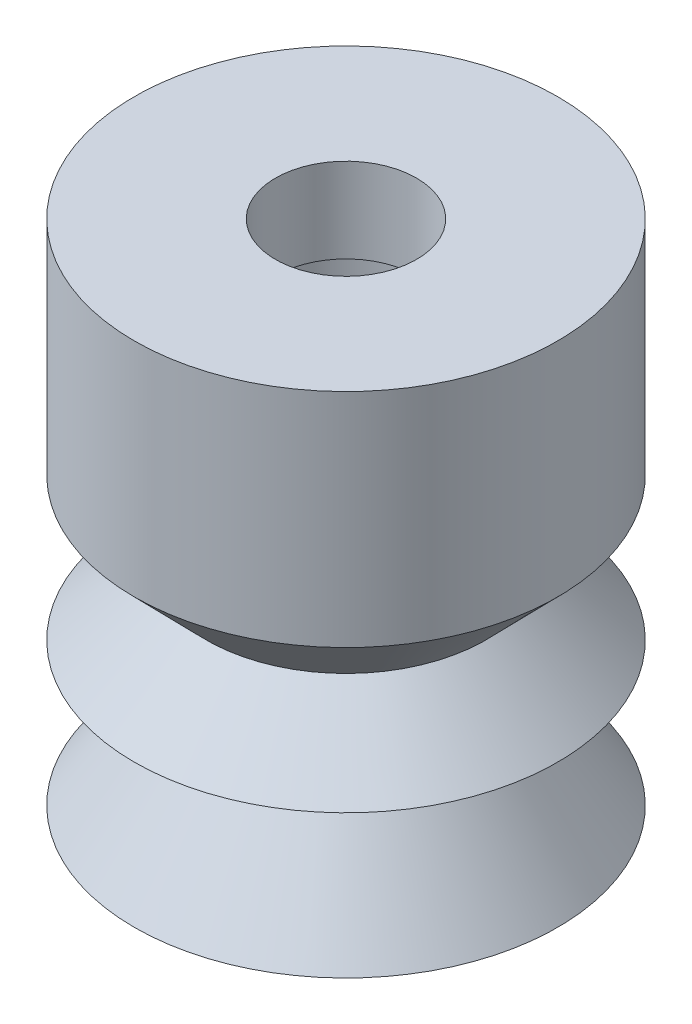
ISO-10303-21;
HEADER;
FILE_DESCRIPTION(('STEP AP214'),'2;1');
FILE_NAME('part.step','',(''),(''),'','','');
FILE_SCHEMA(('AUTOMOTIVE_DESIGN { 1 0 10303 214 1 1 1 1 }'));
ENDSEC;
DATA;
#1=APPLICATION_CONTEXT('core data for automotive mechanical design processes');
#2=APPLICATION_PROTOCOL_DEFINITION('international standard','automotive_design',2000,#1);
#3=PRODUCT_CONTEXT('',#1,'mechanical');
#4=PRODUCT('Part','Part','',(#3));
#5=PRODUCT_RELATED_PRODUCT_CATEGORY('part','',(#4));
#6=PRODUCT_DEFINITION_FORMATION('','',#4);
#7=PRODUCT_DEFINITION_CONTEXT('part definition',#1,'design');
#8=PRODUCT_DEFINITION('design','',#6,#7);
#9=PRODUCT_DEFINITION_SHAPE('','',#8);
#10=(LENGTH_UNIT() NAMED_UNIT(*) SI_UNIT(.MILLI.,.METRE.));
#11=(NAMED_UNIT(*) PLANE_ANGLE_UNIT() SI_UNIT($,.RADIAN.));
#12=(NAMED_UNIT(*) SI_UNIT($,.STERADIAN.) SOLID_ANGLE_UNIT());
#13=UNCERTAINTY_MEASURE_WITH_UNIT(LENGTH_MEASURE(1.E-05),#10,'distance_accuracy_value','');
#14=(GEOMETRIC_REPRESENTATION_CONTEXT(3) GLOBAL_UNCERTAINTY_ASSIGNED_CONTEXT((#13)) GLOBAL_UNIT_ASSIGNED_CONTEXT((#10,
#11,#12)) REPRESENTATION_CONTEXT('',''));
#15=CARTESIAN_POINT('',(0.,0.,0.));
#16=DIRECTION('',(0.,0.,1.));
#17=DIRECTION('',(1.,0.,0.));
#18=AXIS2_PLACEMENT_3D('',#15,#16,#17);
#19=CARTESIAN_POINT('',(0.,0.,0.));
#20=DIRECTION('',(0.,-1.,0.));
#21=DIRECTION('',(0.,0.,-1.));
#22=AXIS2_PLACEMENT_3D('',#19,#20,#21);
#23=CYLINDRICAL_SURFACE('',#22,2.5);
#24=CARTESIAN_POINT('',(0.,18.,0.));
#25=DIRECTION('',(0.,-1.,0.));
#26=DIRECTION('',(0.,0.,-1.));
#27=AXIS2_PLACEMENT_3D('',#24,#25,#26);
#28=CIRCLE('',#27,2.5);
#29=CARTESIAN_POINT('',(0.,18.,-2.5));
#30=VERTEX_POINT('',#29);
#31=EDGE_CURVE('E10',#30,#30,#28,.T.);
#32=ORIENTED_EDGE('',*,*,#31,.F.);
#33=EDGE_LOOP('',(#32));
#34=FACE_BOUND('',#33,.T.);
#35=CARTESIAN_POINT('',(0.,15.,0.));
#36=DIRECTION('',(0.,-1.,0.));
#37=DIRECTION('',(0.,0.,-1.));
#38=AXIS2_PLACEMENT_3D('',#35,#36,#37);
#39=CIRCLE('',#38,2.5);
#40=CARTESIAN_POINT('',(0.,15.,-2.5));
#41=VERTEX_POINT('',#40);
#42=EDGE_CURVE('E81',#41,#41,#39,.T.);
#43=ORIENTED_EDGE('',*,*,#42,.T.);
#44=EDGE_LOOP('',(#43));
#45=FACE_BOUND('',#44,.T.);
#46=ADVANCED_FACE('F32',(#34,#45),#23,.F.);
#47=CARTESIAN_POINT('',(-2.5,18.,0.));
#48=DIRECTION('',(0.,-1.,0.));
#49=DIRECTION('',(0.,0.,-1.));
#50=AXIS2_PLACEMENT_3D('',#47,#48,#49);
#51=PLANE('',#50);
#52=CARTESIAN_POINT('',(0.,18.,0.));
#53=DIRECTION('',(0.,-1.,0.));
#54=DIRECTION('',(0.,0.,-1.));
#55=AXIS2_PLACEMENT_3D('',#52,#53,#54);
#56=CIRCLE('',#55,7.5);
#57=CARTESIAN_POINT('',(0.,18.,-7.5));
#58=VERTEX_POINT('',#57);
#59=EDGE_CURVE('E38',#58,#58,#56,.T.);
#60=ORIENTED_EDGE('',*,*,#59,.F.);
#61=EDGE_LOOP('',(#60));
#62=FACE_BOUND('',#61,.T.);
#63=ORIENTED_EDGE('',*,*,#31,.T.);
#64=EDGE_LOOP('',(#63));
#65=FACE_BOUND('',#64,.T.);
#66=ADVANCED_FACE('F160',(#62,#65),#51,.F.);
#67=CARTESIAN_POINT('',(0.,0.,0.));
#68=DIRECTION('',(0.,-1.,0.));
#69=DIRECTION('',(0.,0.,-1.));
#70=AXIS2_PLACEMENT_3D('',#67,#68,#69);
#71=CYLINDRICAL_SURFACE('',#70,7.5);
#72=CARTESIAN_POINT('',(0.,10.1414920357619,0.));
#73=DIRECTION('',(0.,-1.,0.));
#74=DIRECTION('',(0.,0.,-1.));
#75=AXIS2_PLACEMENT_3D('',#72,#73,#74);
#76=CIRCLE('',#75,7.5);
#77=CARTESIAN_POINT('',(0.,10.1414920357619,-7.5));
#78=VERTEX_POINT('',#77);
#79=EDGE_CURVE('E42',#78,#78,#76,.T.);
#80=ORIENTED_EDGE('',*,*,#79,.F.);
#81=EDGE_LOOP('',(#80));
#82=FACE_BOUND('',#81,.T.);
#83=ORIENTED_EDGE('',*,*,#59,.T.);
#84=EDGE_LOOP('',(#83));
#85=FACE_BOUND('',#84,.T.);
#86=ADVANCED_FACE('F155',(#82,#85),#71,.T.);
#87=CARTESIAN_POINT('',(0.,10.1414920357619,0.));
#88=DIRECTION('',(0.,1.,0.));
#89=DIRECTION('',(0.,0.,1.));
#90=AXIS2_PLACEMENT_3D('',#87,#88,#89);
#91=CONICAL_SURFACE('',#90,7.5,0.775945219730871);
#92=CARTESIAN_POINT('',(0.,7.54422525791049,0.));
#93=DIRECTION('',(0.,-1.,0.));
#94=DIRECTION('',(0.,0.,-1.));
#95=AXIS2_PLACEMENT_3D('',#92,#93,#94);
#96=CIRCLE('',#95,4.95137846345722);
#97=CARTESIAN_POINT('',(0.,7.54422525791049,-4.95137846345722));
#98=VERTEX_POINT('',#97);
#99=EDGE_CURVE('E46',#98,#98,#96,.T.);
#100=ORIENTED_EDGE('',*,*,#99,.F.);
#101=EDGE_LOOP('',(#100));
#102=FACE_BOUND('',#101,.T.);
#103=ORIENTED_EDGE('',*,*,#79,.T.);
#104=EDGE_LOOP('',(#103));
#105=FACE_BOUND('',#104,.T.);
#106=ADVANCED_FACE('F149',(#102,#105),#91,.T.);
#107=CARTESIAN_POINT('',(0.,7.54422525791049,0.));
#108=DIRECTION('',(0.,-1.,0.));
#109=DIRECTION('',(0.,0.,-1.));
#110=AXIS2_PLACEMENT_3D('',#107,#108,#109);
#111=CONICAL_SURFACE('',#110,4.95137846345722,0.800359370512206);
#112=CARTESIAN_POINT('',(0.,5.07074601788093,0.));
#113=DIRECTION('',(0.,-1.,0.));
#114=DIRECTION('',(0.,0.,-1.));
#115=AXIS2_PLACEMENT_3D('',#112,#113,#114);
#116=CIRCLE('',#115,7.5);
#117=CARTESIAN_POINT('',(0.,5.07074601788093,-7.5));
#118=VERTEX_POINT('',#117);
#119=EDGE_CURVE('E51',#118,#118,#116,.T.);
#120=ORIENTED_EDGE('',*,*,#119,.F.);
#121=EDGE_LOOP('',(#120));
#122=FACE_BOUND('',#121,.T.);
#123=ORIENTED_EDGE('',*,*,#99,.T.);
#124=EDGE_LOOP('',(#123));
#125=FACE_BOUND('',#124,.T.);
#126=ADVANCED_FACE('F143',(#122,#125),#111,.T.);
#127=CARTESIAN_POINT('',(0.,5.07074601788093,0.));
#128=DIRECTION('',(0.,1.,0.));
#129=DIRECTION('',(0.,0.,1.));
#130=AXIS2_PLACEMENT_3D('',#127,#128,#129);
#131=CONICAL_SURFACE('',#130,7.5,1.0494749072409);
#132=CARTESIAN_POINT('',(0.,3.60702736402596,0.));
#133=DIRECTION('',(0.,-1.,0.));
#134=DIRECTION('',(0.,0.,-1.));
#135=AXIS2_PLACEMENT_3D('',#132,#133,#134);
#136=CIRCLE('',#135,4.95137846345722);
#137=CARTESIAN_POINT('',(0.,3.60702736402596,-4.95137846345722));
#138=VERTEX_POINT('',#137);
#139=EDGE_CURVE('E54',#138,#138,#136,.T.);
#140=ORIENTED_EDGE('',*,*,#139,.F.);
#141=EDGE_LOOP('',(#140));
#142=FACE_BOUND('',#141,.T.);
#143=ORIENTED_EDGE('',*,*,#119,.T.);
#144=EDGE_LOOP('',(#143));
#145=FACE_BOUND('',#144,.T.);
#146=ADVANCED_FACE('F137',(#142,#145),#131,.T.);
#147=CARTESIAN_POINT('',(0.,3.60702736402596,0.));
#148=DIRECTION('',(0.,-1.,0.));
#149=DIRECTION('',(0.,0.,-1.));
#150=AXIS2_PLACEMENT_3D('',#147,#148,#149);
#151=CONICAL_SURFACE('',#150,4.95137846345722,0.615122542850016);
#152=CARTESIAN_POINT('',(0.,0.,0.));
#153=DIRECTION('',(0.,-1.,0.));
#154=DIRECTION('',(0.,0.,-1.));
#155=AXIS2_PLACEMENT_3D('',#152,#153,#154);
#156=CIRCLE('',#155,7.5);
#157=CARTESIAN_POINT('',(0.,0.,-7.5));
#158=VERTEX_POINT('',#157);
#159=EDGE_CURVE('E57',#158,#158,#156,.T.);
#160=ORIENTED_EDGE('',*,*,#159,.F.);
#161=EDGE_LOOP('',(#160));
#162=FACE_BOUND('',#161,.T.);
#163=ORIENTED_EDGE('',*,*,#139,.T.);
#164=EDGE_LOOP('',(#163));
#165=FACE_BOUND('',#164,.T.);
#166=ADVANCED_FACE('F131',(#162,#165),#151,.T.);
#167=CARTESIAN_POINT('',(-7.5,0.,0.));
#168=DIRECTION('',(0.,1.,0.));
#169=DIRECTION('',(0.,0.,1.));
#170=AXIS2_PLACEMENT_3D('',#167,#168,#169);
#171=PLANE('',#170);
#172=CARTESIAN_POINT('',(0.,0.,0.));
#173=DIRECTION('',(0.,-1.,0.));
#174=DIRECTION('',(0.,0.,-1.));
#175=AXIS2_PLACEMENT_3D('',#172,#173,#174);
#176=CIRCLE('',#175,7.33699276403686);
#177=CARTESIAN_POINT('',(0.,0.,-7.33699276403686));
#178=VERTEX_POINT('',#177);
#179=EDGE_CURVE('E60',#178,#178,#176,.T.);
#180=ORIENTED_EDGE('',*,*,#179,.F.);
#181=EDGE_LOOP('',(#180));
#182=FACE_BOUND('',#181,.T.);
#183=ORIENTED_EDGE('',*,*,#159,.T.);
#184=EDGE_LOOP('',(#183));
#185=FACE_BOUND('',#184,.T.);
#186=ADVANCED_FACE('F125',(#182,#185),#171,.F.);
#187=CARTESIAN_POINT('',(0.,0.,0.));
#188=DIRECTION('',(0.,-1.,0.));
#189=DIRECTION('',(0.,0.,-1.));
#190=AXIS2_PLACEMENT_3D('',#187,#188,#189);
#191=CONICAL_SURFACE('',#190,7.33699276403686,0.816280976946262);
#192=CARTESIAN_POINT('',(0.,3.60702736402596,0.));
#193=DIRECTION('',(0.,-1.,0.));
#194=DIRECTION('',(0.,0.,-1.));
#195=AXIS2_PLACEMENT_3D('',#192,#193,#194);
#196=CIRCLE('',#195,3.5);
#197=CARTESIAN_POINT('',(0.,3.60702736402596,-3.5));
#198=VERTEX_POINT('',#197);
#199=EDGE_CURVE('E63',#198,#198,#196,.T.);
#200=ORIENTED_EDGE('',*,*,#199,.F.);
#201=EDGE_LOOP('',(#200));
#202=FACE_BOUND('',#201,.T.);
#203=ORIENTED_EDGE('',*,*,#179,.T.);
#204=EDGE_LOOP('',(#203));
#205=FACE_BOUND('',#204,.T.);
#206=ADVANCED_FACE('F119',(#202,#205),#191,.F.);
#207=CARTESIAN_POINT('',(0.,3.60702736402596,0.));
#208=DIRECTION('',(0.,1.,0.));
#209=DIRECTION('',(0.,0.,1.));
#210=AXIS2_PLACEMENT_3D('',#207,#208,#209);
#211=CONICAL_SURFACE('',#210,3.5,1.0494749072409);
#212=CARTESIAN_POINT('',(0.,5.07074601788093,0.));
#213=DIRECTION('',(0.,-1.,0.));
#214=DIRECTION('',(0.,0.,-1.));
#215=AXIS2_PLACEMENT_3D('',#212,#213,#214);
#216=CIRCLE('',#215,6.04862153654278);
#217=CARTESIAN_POINT('',(0.,5.07074601788093,-6.04862153654278));
#218=VERTEX_POINT('',#217);
#219=EDGE_CURVE('E66',#218,#218,#216,.T.);
#220=ORIENTED_EDGE('',*,*,#219,.F.);
#221=EDGE_LOOP('',(#220));
#222=FACE_BOUND('',#221,.T.);
#223=ORIENTED_EDGE('',*,*,#199,.T.);
#224=EDGE_LOOP('',(#223));
#225=FACE_BOUND('',#224,.T.);
#226=ADVANCED_FACE('F113',(#222,#225),#211,.F.);
#227=CARTESIAN_POINT('',(0.,5.07074601788093,0.));
#228=DIRECTION('',(0.,-1.,0.));
#229=DIRECTION('',(0.,0.,-1.));
#230=AXIS2_PLACEMENT_3D('',#227,#228,#229);
#231=CONICAL_SURFACE('',#230,6.04862153654278,0.800359370512207);
#232=CARTESIAN_POINT('',(0.,9.,0.));
#233=DIRECTION('',(0.,-1.,0.));
#234=DIRECTION('',(0.,0.,-1.));
#235=AXIS2_PLACEMENT_3D('',#232,#233,#234);
#236=CIRCLE('',#235,2.);
#237=CARTESIAN_POINT('',(0.,9.,-2.));
#238=VERTEX_POINT('',#237);
#239=EDGE_CURVE('E69',#238,#238,#236,.T.);
#240=CARTESIAN_POINT('',(0.,9.,-2.));
#241=CARTESIAN_POINT('',(0.,8.95907027101959,-2.04217314100565));
#242=CARTESIAN_POINT('',(0.,8.91814054203919,-2.08434628201131));
#243=CARTESIAN_POINT('',(0.,8.83628108407837,-2.16869256402261));
#244=CARTESIAN_POINT('',(0.,8.79535135509797,-2.21086570502827));
#245=CARTESIAN_POINT('',(0.,8.71349189713715,-2.29521198703958));
#246=CARTESIAN_POINT('',(0.,8.67256216815674,-2.33738512804523));
#247=CARTESIAN_POINT('',(0.,8.59070271019593,-2.42173141005654));
#248=CARTESIAN_POINT('',(0.,8.54977298121552,-2.46390455106219));
#249=CARTESIAN_POINT('',(0.,8.46791352325471,-2.5482508330735));
#250=CARTESIAN_POINT('',(0.,8.4269837942743,-2.59042397407915));
#251=CARTESIAN_POINT('',(0.,8.34512433631349,-2.67477025609046));
#252=CARTESIAN_POINT('',(0.,8.30419460733308,-2.71694339709612));
#253=CARTESIAN_POINT('',(0.,8.22233514937227,-2.80128967910742));
#254=CARTESIAN_POINT('',(0.,8.18140542039186,-2.84346282011308));
#255=CARTESIAN_POINT('',(0.,8.09954596243105,-2.92780910212439));
#256=CARTESIAN_POINT('',(0.,8.05861623345064,-2.96998224313004));
#257=CARTESIAN_POINT('',(0.,7.97675677548983,-3.05432852514135));
#258=CARTESIAN_POINT('',(0.,7.93582704650942,-3.096501666147));
#259=CARTESIAN_POINT('',(0.,7.8539675885486,-3.18084794815831));
#260=CARTESIAN_POINT('',(0.,7.8130378595682,-3.22302108916396));
#261=CARTESIAN_POINT('',(0.,7.73117840160738,-3.30736737117527));
#262=CARTESIAN_POINT('',(0.,7.69024867262698,-3.34954051218092));
#263=CARTESIAN_POINT('',(0.,7.60838921466616,-3.43388679419223));
#264=CARTESIAN_POINT('',(0.,7.56745948568576,-3.47605993519789));
#265=CARTESIAN_POINT('',(0.,7.48560002772494,-3.5604062172092));
#266=CARTESIAN_POINT('',(0.,7.44467029874453,-3.60257935821485));
#267=CARTESIAN_POINT('',(0.,7.36281084078372,-3.68692564022616));
#268=CARTESIAN_POINT('',(0.,7.32188111180331,-3.72909878123181));
#269=CARTESIAN_POINT('',(0.,7.2400216538425,-3.81344506324312));
#270=CARTESIAN_POINT('',(0.,7.19909192486209,-3.85561820424877));
#271=CARTESIAN_POINT('',(0.,7.11723246690128,-3.93996448626008));
#272=CARTESIAN_POINT('',(0.,7.07630273792087,-3.98213762726574));
#273=CARTESIAN_POINT('',(0.,6.99444327996006,-4.06648390927704));
#274=CARTESIAN_POINT('',(0.,6.95351355097965,-4.1086570502827));
#275=CARTESIAN_POINT('',(0.,6.87165409301884,-4.193003332294));
#276=CARTESIAN_POINT('',(0.,6.83072436403843,-4.23517647329966));
#277=CARTESIAN_POINT('',(0.,6.74886490607761,-4.31952275531097));
#278=CARTESIAN_POINT('',(0.,6.70793517709721,-4.36169589631662));
#279=CARTESIAN_POINT('',(0.,6.6260757191364,-4.44604217832793));
#280=CARTESIAN_POINT('',(0.,6.58514599015599,-4.48821531933358));
#281=CARTESIAN_POINT('',(0.,6.50328653219517,-4.57256160134489));
#282=CARTESIAN_POINT('',(0.,6.46235680321477,-4.61473474235054));
#283=CARTESIAN_POINT('',(0.,6.38049734525395,-4.69908102436185));
#284=CARTESIAN_POINT('',(0.,6.33956761627354,-4.74125416536751));
#285=CARTESIAN_POINT('',(0.,6.25770815831273,-4.82560044737881));
#286=CARTESIAN_POINT('',(0.,6.21677842933232,-4.86777358838447));
#287=CARTESIAN_POINT('',(0.,6.13491897137151,-4.95211987039578));
#288=CARTESIAN_POINT('',(0.,6.0939892423911,-4.99429301140143));
#289=CARTESIAN_POINT('',(0.,6.01212978443029,-5.07863929341274));
#290=CARTESIAN_POINT('',(0.,5.97120005544988,-5.12081243441839));
#291=CARTESIAN_POINT('',(0.,5.88934059748907,-5.2051587164297));
#292=CARTESIAN_POINT('',(0.,5.84841086850866,-5.24733185743535));
#293=CARTESIAN_POINT('',(0.,5.76655141054785,-5.33167813944666));
#294=CARTESIAN_POINT('',(0.,5.72562168156744,-5.37385128045232));
#295=CARTESIAN_POINT('',(0.,5.64376222360663,-5.45819756246362));
#296=CARTESIAN_POINT('',(0.,5.60283249462622,-5.50037070346928));
#297=CARTESIAN_POINT('',(0.,5.52097303666541,-5.58471698548059));
#298=CARTESIAN_POINT('',(0.,5.480043307685,-5.62689012648624));
#299=CARTESIAN_POINT('',(0.,5.39818384972418,-5.71123640849755));
#300=CARTESIAN_POINT('',(0.,5.35725412074378,-5.7534095495032));
#301=CARTESIAN_POINT('',(0.,5.27539466278296,-5.83775583151451));
#302=CARTESIAN_POINT('',(0.,5.23446493380256,-5.87992897252016));
#303=CARTESIAN_POINT('',(0.,5.15260547584174,-5.96427525453147));
#304=CARTESIAN_POINT('',(0.,5.11167574686134,-6.00644839553712));
#305=CARTESIAN_POINT('',(0.,5.07074601788093,-6.04862153654278));
#306=B_SPLINE_CURVE_WITH_KNOTS('',3,(#240,#241,#242,#243,#244,#245,#246,#247,#248,#249,#250,
#251,#252,#253,#254,#255,#256,#257,#258,#259,#260,#261,#262,#263,#264,#265,#266,#267,#268,#269,
#270,#271,#272,#273,#274,#275,#276,#277,#278,#279,#280,#281,#282,#283,#284,#285,#286,#287,#288,
#289,#290,#291,#292,#293,#294,#295,#296,#297,#298,#299,#300,#301,#302,#303,#304,#305),
.UNSPECIFIED.,.F.,.F.,(4,2,2,2,2,2,2,2,2,2,2,2,2,2,2,2,2,2,2,2,2,2,2,2,2,2,2,2,2,2,2,2,4),(0.,
0.176307540480352,0.352615080960705,0.528922621441057,0.705230161921409,0.881537702401762,
1.05784524288211,1.23415278336247,1.41046032384282,1.58676786432317,1.76307540480352,
1.93938294528388,2.11569048576423,2.29199802624458,2.46830556672493,2.64461310720529,
2.82092064768564,2.99722818816599,3.17353572864634,3.34984326912669,3.52615080960705,
3.7024583500874,3.87876589056775,4.0550734310481,4.23138097152846,4.40768851200881,
4.58399605248916,4.76030359296951,4.93661113344987,5.11291867393022,5.28922621441057,
5.46553375489092,5.64184129537128),.UNSPECIFIED.);
#307=EDGE_CURVE('BSEAM107',#238,#218,#306,.T.);
#308=ORIENTED_EDGE('',*,*,#239,.F.);
#309=ORIENTED_EDGE('',*,*,#219,.T.);
#310=ORIENTED_EDGE('',*,*,#307,.T.);
#311=ORIENTED_EDGE('',*,*,#307,.F.);
#312=EDGE_LOOP('',(#308,#310,#309,#311));
#313=FACE_BOUND('',#312,.T.);
#314=ADVANCED_FACE('F107',(#313),#231,.F.);
#315=CARTESIAN_POINT('',(0.,0.,0.));
#316=DIRECTION('',(0.,-1.,0.));
#317=DIRECTION('',(0.,0.,-1.));
#318=AXIS2_PLACEMENT_3D('',#315,#316,#317);
#319=CYLINDRICAL_SURFACE('',#318,2.);
#320=CARTESIAN_POINT('',(0.,13.,0.));
#321=DIRECTION('',(0.,-1.,0.));
#322=DIRECTION('',(0.,0.,-1.));
#323=AXIS2_PLACEMENT_3D('',#320,#321,#322);
#324=CIRCLE('',#323,2.);
#325=CARTESIAN_POINT('',(0.,13.,-2.));
#326=VERTEX_POINT('',#325);
#327=EDGE_CURVE('E72',#326,#326,#324,.T.);
#328=ORIENTED_EDGE('',*,*,#327,.F.);
#329=EDGE_LOOP('',(#328));
#330=FACE_BOUND('',#329,.T.);
#331=ORIENTED_EDGE('',*,*,#239,.T.);
#332=EDGE_LOOP('',(#331));
#333=FACE_BOUND('',#332,.T.);
#334=ADVANCED_FACE('F101',(#330,#333),#319,.F.);
#335=CARTESIAN_POINT('',(-2.,13.,0.));
#336=DIRECTION('',(0.,-1.,0.));
#337=DIRECTION('',(0.,0.,-1.));
#338=AXIS2_PLACEMENT_3D('',#335,#336,#337);
#339=PLANE('',#338);
#340=CARTESIAN_POINT('',(0.,13.,0.));
#341=DIRECTION('',(0.,-1.,0.));
#342=DIRECTION('',(0.,0.,-1.));
#343=AXIS2_PLACEMENT_3D('',#340,#341,#342);
#344=CIRCLE('',#343,3.4);
#345=CARTESIAN_POINT('',(0.,13.,-3.4));
#346=VERTEX_POINT('',#345);
#347=EDGE_CURVE('E75',#346,#346,#344,.T.);
#348=ORIENTED_EDGE('',*,*,#347,.F.);
#349=EDGE_LOOP('',(#348));
#350=FACE_BOUND('',#349,.T.);
#351=ORIENTED_EDGE('',*,*,#327,.T.);
#352=EDGE_LOOP('',(#351));
#353=FACE_BOUND('',#352,.T.);
#354=ADVANCED_FACE('F95',(#350,#353),#339,.F.);
#355=CARTESIAN_POINT('',(0.,0.,0.));
#356=DIRECTION('',(0.,-1.,0.));
#357=DIRECTION('',(0.,0.,-1.));
#358=AXIS2_PLACEMENT_3D('',#355,#356,#357);
#359=CYLINDRICAL_SURFACE('',#358,3.4);
#360=CARTESIAN_POINT('',(0.,15.,0.));
#361=DIRECTION('',(0.,-1.,0.));
#362=DIRECTION('',(0.,0.,-1.));
#363=AXIS2_PLACEMENT_3D('',#360,#361,#362);
#364=CIRCLE('',#363,3.4);
#365=CARTESIAN_POINT('',(0.,15.,-3.4));
#366=VERTEX_POINT('',#365);
#367=EDGE_CURVE('E78',#366,#366,#364,.T.);
#368=ORIENTED_EDGE('',*,*,#367,.F.);
#369=EDGE_LOOP('',(#368));
#370=FACE_BOUND('',#369,.T.);
#371=ORIENTED_EDGE('',*,*,#347,.T.);
#372=EDGE_LOOP('',(#371));
#373=FACE_BOUND('',#372,.T.);
#374=ADVANCED_FACE('F89',(#370,#373),#359,.F.);
#375=CARTESIAN_POINT('',(-3.4,15.,0.));
#376=DIRECTION('',(0.,1.,0.));
#377=DIRECTION('',(0.,0.,1.));
#378=AXIS2_PLACEMENT_3D('',#375,#376,#377);
#379=PLANE('',#378);
#380=ORIENTED_EDGE('',*,*,#42,.F.);
#381=EDGE_LOOP('',(#380));
#382=FACE_BOUND('',#381,.T.);
#383=ORIENTED_EDGE('',*,*,#367,.T.);
#384=EDGE_LOOP('',(#383));
#385=FACE_BOUND('',#384,.T.);
#386=ADVANCED_FACE('F86',(#382,#385),#379,.F.);
#387=CLOSED_SHELL('',(#46,#66,#86,#106,#126,#146,#166,#186,#206,#226,#314,#334,#354,#374,#386));
#388=MANIFOLD_SOLID_BREP('B2',#387);
#389=ADVANCED_BREP_SHAPE_REPRESENTATION('',(#18,#388),#14);
#390=SHAPE_DEFINITION_REPRESENTATION(#9,#389);
ENDSEC;
END-ISO-10303-21;
